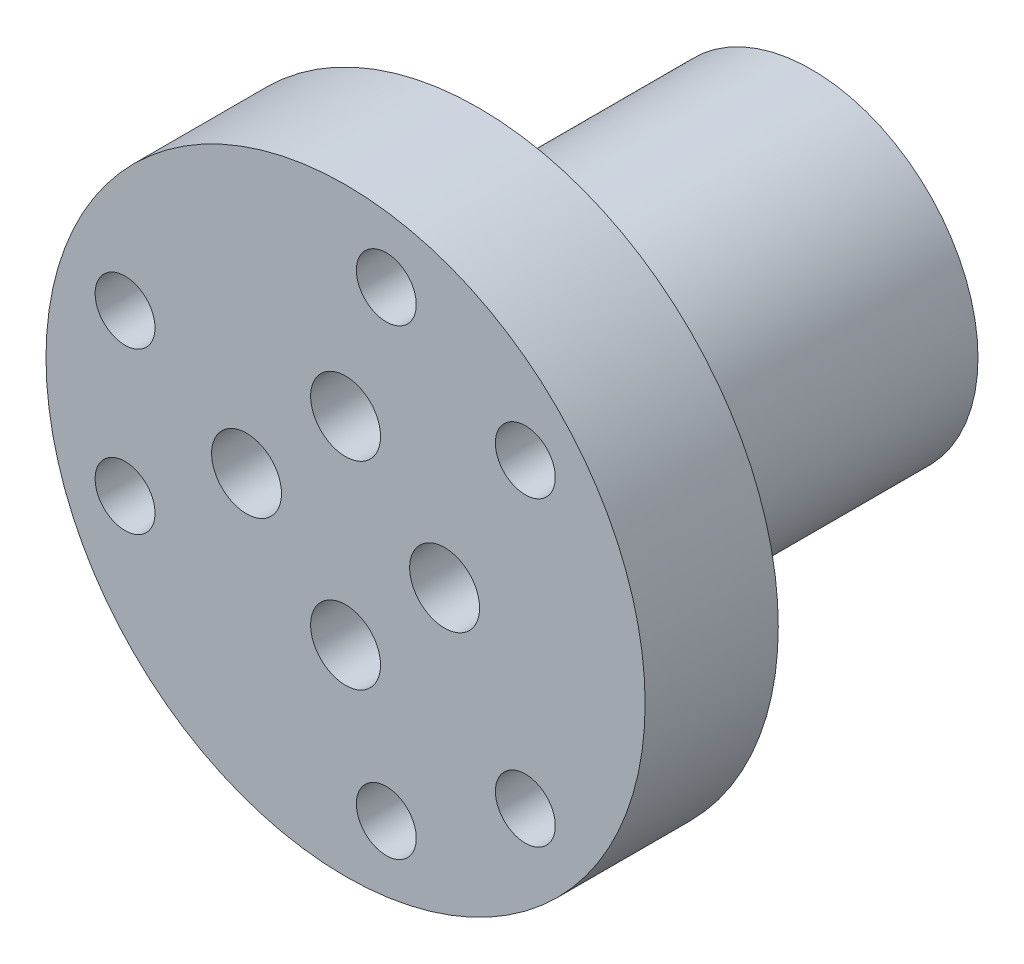
ISO-10303-21;
HEADER;
FILE_DESCRIPTION(('STEP AP214'),'2;1');
FILE_NAME('part.step','',(''),(''),'','','');
FILE_SCHEMA(('AUTOMOTIVE_DESIGN { 1 0 10303 214 1 1 1 1 }'));
ENDSEC;
DATA;
#1=APPLICATION_CONTEXT('core data for automotive mechanical design processes');
#2=APPLICATION_PROTOCOL_DEFINITION('international standard','automotive_design',2000,#1);
#3=PRODUCT_CONTEXT('',#1,'mechanical');
#4=PRODUCT('Part','Part','',(#3));
#5=PRODUCT_RELATED_PRODUCT_CATEGORY('part','',(#4));
#6=PRODUCT_DEFINITION_FORMATION('','',#4);
#7=PRODUCT_DEFINITION_CONTEXT('part definition',#1,'design');
#8=PRODUCT_DEFINITION('design','',#6,#7);
#9=PRODUCT_DEFINITION_SHAPE('','',#8);
#10=(LENGTH_UNIT() NAMED_UNIT(*) SI_UNIT(.MILLI.,.METRE.));
#11=(NAMED_UNIT(*) PLANE_ANGLE_UNIT() SI_UNIT($,.RADIAN.));
#12=(NAMED_UNIT(*) SI_UNIT($,.STERADIAN.) SOLID_ANGLE_UNIT());
#13=UNCERTAINTY_MEASURE_WITH_UNIT(LENGTH_MEASURE(1.E-05),#10,'distance_accuracy_value','');
#14=(GEOMETRIC_REPRESENTATION_CONTEXT(3) GLOBAL_UNCERTAINTY_ASSIGNED_CONTEXT((#13)) GLOBAL_UNIT_ASSIGNED_CONTEXT((#10,
#11,#12)) REPRESENTATION_CONTEXT('',''));
#15=CARTESIAN_POINT('',(0.,0.,0.));
#16=DIRECTION('',(0.,0.,1.));
#17=DIRECTION('',(1.,0.,0.));
#18=AXIS2_PLACEMENT_3D('',#15,#16,#17);
#19=CARTESIAN_POINT('',(0.,0.,0.));
#20=DIRECTION('',(0.,0.,1.));
#21=DIRECTION('',(1.,0.,0.));
#22=AXIS2_PLACEMENT_3D('',#19,#20,#21);
#23=PLANE('',#22);
#24=CARTESIAN_POINT('',(0.,0.,0.));
#25=DIRECTION('',(0.,0.,1.));
#26=DIRECTION('',(1.,0.,0.));
#27=AXIS2_PLACEMENT_3D('',#24,#25,#26);
#28=CIRCLE('',#27,18.);
#29=CARTESIAN_POINT('',(18.,0.,0.));
#30=VERTEX_POINT('',#29);
#31=EDGE_CURVE('E44',#30,#30,#28,.T.);
#32=ORIENTED_EDGE('',*,*,#31,.F.);
#33=EDGE_LOOP('',(#32));
#34=FACE_BOUND('',#33,.T.);
#35=CARTESIAN_POINT('',(10.8012266479773,9.06330529658191,0.));
#36=DIRECTION('',(0.,0.,-1.));
#37=DIRECTION('',(-1.,0.,0.));
#38=AXIS2_PLACEMENT_3D('',#35,#36,#37);
#39=CIRCLE('',#38,3.15);
#40=CARTESIAN_POINT('',(7.65122664797731,9.06330529658191,0.));
#41=VERTEX_POINT('',#40);
#42=EDGE_CURVE('E68',#41,#41,#39,.T.);
#43=ORIENTED_EDGE('',*,*,#42,.F.);
#44=EDGE_LOOP('',(#43));
#45=FACE_BOUND('',#44,.T.);
#46=CARTESIAN_POINT('',(10.8012266479789,-9.06330529657909,0.));
#47=DIRECTION('',(0.,0.,-1.));
#48=DIRECTION('',(-1.,0.,0.));
#49=AXIS2_PLACEMENT_3D('',#46,#47,#48);
#50=CIRCLE('',#49,3.15);
#51=CARTESIAN_POINT('',(7.65122664797894,-9.06330529657909,0.));
#52=VERTEX_POINT('',#51);
#53=EDGE_CURVE('E77',#52,#52,#50,.T.);
#54=ORIENTED_EDGE('',*,*,#53,.F.);
#55=EDGE_LOOP('',(#54));
#56=FACE_BOUND('',#55,.T.);
#57=CARTESIAN_POINT('',(2.44843930510505,-13.885789317471,0.));
#58=DIRECTION('',(0.,0.,-1.));
#59=DIRECTION('',(-1.,0.,0.));
#60=AXIS2_PLACEMENT_3D('',#57,#58,#59);
#61=CIRCLE('',#60,3.15);
#62=CARTESIAN_POINT('',(-0.701560694894948,-13.885789317471,0.));
#63=VERTEX_POINT('',#62);
#64=EDGE_CURVE('E86',#63,#63,#61,.T.);
#65=ORIENTED_EDGE('',*,*,#64,.F.);
#66=EDGE_LOOP('',(#65));
#67=FACE_BOUND('',#66,.T.);
#68=CARTESIAN_POINT('',(-13.2496659530813,-4.82248402089194,0.));
#69=DIRECTION('',(0.,0.,-1.));
#70=DIRECTION('',(-1.,0.,0.));
#71=AXIS2_PLACEMENT_3D('',#68,#69,#70);
#72=CIRCLE('',#71,3.15);
#73=CARTESIAN_POINT('',(-16.3996659530813,-4.82248402089194,0.));
#74=VERTEX_POINT('',#73);
#75=EDGE_CURVE('E95',#74,#74,#72,.T.);
#76=ORIENTED_EDGE('',*,*,#75,.F.);
#77=EDGE_LOOP('',(#76));
#78=FACE_BOUND('',#77,.T.);
#79=CARTESIAN_POINT('',(-13.2496659530813,4.82248402089194,0.));
#80=DIRECTION('',(0.,0.,-1.));
#81=DIRECTION('',(-1.,0.,0.));
#82=AXIS2_PLACEMENT_3D('',#79,#80,#81);
#83=CIRCLE('',#82,3.15);
#84=CARTESIAN_POINT('',(-16.3996659530813,4.82248402089194,0.));
#85=VERTEX_POINT('',#84);
#86=EDGE_CURVE('E104',#85,#85,#83,.T.);
#87=ORIENTED_EDGE('',*,*,#86,.F.);
#88=EDGE_LOOP('',(#87));
#89=FACE_BOUND('',#88,.T.);
#90=CARTESIAN_POINT('',(2.44843930510341,13.8857893174738,0.));
#91=DIRECTION('',(0.,0.,-1.));
#92=DIRECTION('',(-1.,0.,0.));
#93=AXIS2_PLACEMENT_3D('',#90,#91,#92);
#94=CIRCLE('',#93,3.15);
#95=CARTESIAN_POINT('',(-0.701560694896587,13.8857893174738,0.));
#96=VERTEX_POINT('',#95);
#97=EDGE_CURVE('E113',#96,#96,#94,.T.);
#98=ORIENTED_EDGE('',*,*,#97,.F.);
#99=EDGE_LOOP('',(#98));
#100=FACE_BOUND('',#99,.T.);
#101=CARTESIAN_POINT('',(0.,0.,0.));
#102=DIRECTION('',(0.,0.,1.));
#103=DIRECTION('',(1.,0.,0.));
#104=AXIS2_PLACEMENT_3D('',#101,#102,#103);
#105=CIRCLE('',#104,10.);
#106=CARTESIAN_POINT('',(10.,0.,0.));
#107=VERTEX_POINT('',#106);
#108=EDGE_CURVE('E10',#107,#107,#105,.F.);
#109=ORIENTED_EDGE('',*,*,#108,.F.);
#110=EDGE_LOOP('',(#109));
#111=FACE_BOUND('',#110,.T.);
#112=ADVANCED_FACE('F33',(#34,#45,#56,#67,#78,#89,#100,#111),#23,.F.);
#113=CARTESIAN_POINT('',(0.,0.,8.));
#114=DIRECTION('',(0.,0.,1.));
#115=DIRECTION('',(1.,0.,0.));
#116=AXIS2_PLACEMENT_3D('',#113,#114,#115);
#117=PLANE('',#116);
#118=CARTESIAN_POINT('',(2.44843930510341,13.8857893174738,8.));
#119=DIRECTION('',(0.,0.,-1.));
#120=DIRECTION('',(-1.,0.,0.));
#121=AXIS2_PLACEMENT_3D('',#118,#119,#120);
#122=CIRCLE('',#121,1.8);
#123=CARTESIAN_POINT('',(0.648439305103415,13.8857893174738,8.));
#124=VERTEX_POINT('',#123);
#125=EDGE_CURVE('E107',#124,#124,#122,.T.);
#126=ORIENTED_EDGE('',*,*,#125,.T.);
#127=EDGE_LOOP('',(#126));
#128=FACE_BOUND('',#127,.T.);
#129=CARTESIAN_POINT('',(-13.2496659530813,4.82248402089194,8.));
#130=DIRECTION('',(0.,0.,-1.));
#131=DIRECTION('',(-1.,0.,0.));
#132=AXIS2_PLACEMENT_3D('',#129,#130,#131);
#133=CIRCLE('',#132,1.8);
#134=CARTESIAN_POINT('',(-15.0496659530813,4.82248402089194,8.));
#135=VERTEX_POINT('',#134);
#136=EDGE_CURVE('E98',#135,#135,#133,.T.);
#137=ORIENTED_EDGE('',*,*,#136,.T.);
#138=EDGE_LOOP('',(#137));
#139=FACE_BOUND('',#138,.T.);
#140=CARTESIAN_POINT('',(-13.2496659530813,-4.82248402089194,8.));
#141=DIRECTION('',(0.,0.,-1.));
#142=DIRECTION('',(-1.,0.,0.));
#143=AXIS2_PLACEMENT_3D('',#140,#141,#142);
#144=CIRCLE('',#143,1.8);
#145=CARTESIAN_POINT('',(-15.0496659530813,-4.82248402089194,8.));
#146=VERTEX_POINT('',#145);
#147=EDGE_CURVE('E89',#146,#146,#144,.T.);
#148=ORIENTED_EDGE('',*,*,#147,.T.);
#149=EDGE_LOOP('',(#148));
#150=FACE_BOUND('',#149,.T.);
#151=CARTESIAN_POINT('',(2.44843930510505,-13.885789317471,8.));
#152=DIRECTION('',(0.,0.,-1.));
#153=DIRECTION('',(-1.,0.,0.));
#154=AXIS2_PLACEMENT_3D('',#151,#152,#153);
#155=CIRCLE('',#154,1.8);
#156=CARTESIAN_POINT('',(0.648439305105053,-13.885789317471,8.));
#157=VERTEX_POINT('',#156);
#158=EDGE_CURVE('E80',#157,#157,#155,.T.);
#159=ORIENTED_EDGE('',*,*,#158,.T.);
#160=EDGE_LOOP('',(#159));
#161=FACE_BOUND('',#160,.T.);
#162=CARTESIAN_POINT('',(10.8012266479789,-9.06330529657909,8.));
#163=DIRECTION('',(0.,0.,-1.));
#164=DIRECTION('',(-1.,0.,0.));
#165=AXIS2_PLACEMENT_3D('',#162,#163,#164);
#166=CIRCLE('',#165,1.8);
#167=CARTESIAN_POINT('',(9.00122664797894,-9.06330529657909,8.));
#168=VERTEX_POINT('',#167);
#169=EDGE_CURVE('E71',#168,#168,#166,.T.);
#170=ORIENTED_EDGE('',*,*,#169,.T.);
#171=EDGE_LOOP('',(#170));
#172=FACE_BOUND('',#171,.T.);
#173=CARTESIAN_POINT('',(10.8012266479773,9.06330529658191,8.));
#174=DIRECTION('',(0.,0.,-1.));
#175=DIRECTION('',(-1.,0.,0.));
#176=AXIS2_PLACEMENT_3D('',#173,#174,#175);
#177=CIRCLE('',#176,1.8);
#178=CARTESIAN_POINT('',(9.00122664797731,9.06330529658191,8.));
#179=VERTEX_POINT('',#178);
#180=EDGE_CURVE('E58',#179,#179,#177,.T.);
#181=ORIENTED_EDGE('',*,*,#180,.T.);
#182=EDGE_LOOP('',(#181));
#183=FACE_BOUND('',#182,.T.);
#184=CARTESIAN_POINT('',(0.,-5.95,8.));
#185=DIRECTION('',(0.,0.,1.));
#186=DIRECTION('',(1.,0.,0.));
#187=AXIS2_PLACEMENT_3D('',#184,#185,#186);
#188=CIRCLE('',#187,2.1);
#189=CARTESIAN_POINT('',(2.1,-5.95,8.));
#190=VERTEX_POINT('',#189);
#191=EDGE_CURVE('E53',#190,#190,#188,.T.);
#192=ORIENTED_EDGE('',*,*,#191,.F.);
#193=EDGE_LOOP('',(#192));
#194=FACE_BOUND('',#193,.T.);
#195=CARTESIAN_POINT('',(5.95,0.,8.));
#196=DIRECTION('',(0.,0.,1.));
#197=DIRECTION('',(1.,0.,0.));
#198=AXIS2_PLACEMENT_3D('',#195,#196,#197);
#199=CIRCLE('',#198,2.1);
#200=CARTESIAN_POINT('',(8.05,0.,8.));
#201=VERTEX_POINT('',#200);
#202=EDGE_CURVE('E57',#201,#201,#199,.T.);
#203=ORIENTED_EDGE('',*,*,#202,.F.);
#204=EDGE_LOOP('',(#203));
#205=FACE_BOUND('',#204,.T.);
#206=CARTESIAN_POINT('',(-5.95,0.,8.));
#207=DIRECTION('',(0.,0.,1.));
#208=DIRECTION('',(1.,0.,0.));
#209=AXIS2_PLACEMENT_3D('',#206,#207,#208);
#210=CIRCLE('',#209,2.1);
#211=CARTESIAN_POINT('',(-3.85,0.,8.));
#212=VERTEX_POINT('',#211);
#213=EDGE_CURVE('E54',#212,#212,#210,.T.);
#214=ORIENTED_EDGE('',*,*,#213,.F.);
#215=EDGE_LOOP('',(#214));
#216=FACE_BOUND('',#215,.T.);
#217=CARTESIAN_POINT('',(0.,5.95,8.));
#218=DIRECTION('',(0.,0.,1.));
#219=DIRECTION('',(1.,0.,0.));
#220=AXIS2_PLACEMENT_3D('',#217,#218,#219);
#221=CIRCLE('',#220,2.1);
#222=CARTESIAN_POINT('',(2.1,5.95,8.));
#223=VERTEX_POINT('',#222);
#224=EDGE_CURVE('E49',#223,#223,#221,.T.);
#225=ORIENTED_EDGE('',*,*,#224,.F.);
#226=EDGE_LOOP('',(#225));
#227=FACE_BOUND('',#226,.T.);
#228=CARTESIAN_POINT('',(0.,0.,8.));
#229=DIRECTION('',(0.,0.,1.));
#230=DIRECTION('',(1.,0.,0.));
#231=AXIS2_PLACEMENT_3D('',#228,#229,#230);
#232=CIRCLE('',#231,18.);
#233=CARTESIAN_POINT('',(18.,0.,8.));
#234=VERTEX_POINT('',#233);
#235=EDGE_CURVE('E40',#234,#234,#232,.T.);
#236=ORIENTED_EDGE('',*,*,#235,.T.);
#237=EDGE_LOOP('',(#236));
#238=FACE_BOUND('',#237,.T.);
#239=ADVANCED_FACE('F182',(#128,#139,#150,#161,#172,#183,#194,#205,#216,#227,#238),#117,.T.);
#240=CARTESIAN_POINT('',(0.,0.,8.));
#241=DIRECTION('',(0.,0.,-1.));
#242=DIRECTION('',(-1.,0.,0.));
#243=AXIS2_PLACEMENT_3D('',#240,#241,#242);
#244=CYLINDRICAL_SURFACE('',#243,18.);
#245=ORIENTED_EDGE('',*,*,#235,.F.);
#246=EDGE_LOOP('',(#245));
#247=FACE_BOUND('',#246,.T.);
#248=ORIENTED_EDGE('',*,*,#31,.T.);
#249=EDGE_LOOP('',(#248));
#250=FACE_BOUND('',#249,.T.);
#251=ADVANCED_FACE('F35',(#247,#250),#244,.T.);
#252=CARTESIAN_POINT('',(0.,5.95,1.4));
#253=DIRECTION('',(0.,0.,1.));
#254=DIRECTION('',(1.,0.,0.));
#255=AXIS2_PLACEMENT_3D('',#252,#253,#254);
#256=CYLINDRICAL_SURFACE('',#255,2.1);
#257=ORIENTED_EDGE('',*,*,#224,.T.);
#258=EDGE_LOOP('',(#257));
#259=FACE_BOUND('',#258,.T.);
#260=CARTESIAN_POINT('',(0.,5.95,-16.6));
#261=DIRECTION('',(0.,0.,-1.));
#262=DIRECTION('',(-1.,0.,0.));
#263=AXIS2_PLACEMENT_3D('',#260,#261,#262);
#264=CIRCLE('',#263,2.1);
#265=CARTESIAN_POINT('',(-2.1,5.95,-16.6));
#266=VERTEX_POINT('',#265);
#267=EDGE_CURVE('E144',#266,#266,#264,.T.);
#268=ORIENTED_EDGE('',*,*,#267,.T.);
#269=EDGE_LOOP('',(#268));
#270=FACE_BOUND('',#269,.T.);
#271=ADVANCED_FACE('F192',(#259,#270),#256,.F.);
#272=CARTESIAN_POINT('',(-5.95,0.,1.4));
#273=DIRECTION('',(0.,0.,1.));
#274=DIRECTION('',(1.,0.,0.));
#275=AXIS2_PLACEMENT_3D('',#272,#273,#274);
#276=CYLINDRICAL_SURFACE('',#275,2.1);
#277=ORIENTED_EDGE('',*,*,#213,.T.);
#278=EDGE_LOOP('',(#277));
#279=FACE_BOUND('',#278,.T.);
#280=CARTESIAN_POINT('',(-5.95,0.,-16.6));
#281=DIRECTION('',(0.,0.,-1.));
#282=DIRECTION('',(-1.,0.,0.));
#283=AXIS2_PLACEMENT_3D('',#280,#281,#282);
#284=CIRCLE('',#283,2.1);
#285=CARTESIAN_POINT('',(-8.05,0.,-16.6));
#286=VERTEX_POINT('',#285);
#287=EDGE_CURVE('E126',#286,#286,#284,.T.);
#288=ORIENTED_EDGE('',*,*,#287,.T.);
#289=EDGE_LOOP('',(#288));
#290=FACE_BOUND('',#289,.T.);
#291=ADVANCED_FACE('F195',(#279,#290),#276,.F.);
#292=CARTESIAN_POINT('',(0.,-5.95,1.4));
#293=DIRECTION('',(0.,0.,1.));
#294=DIRECTION('',(1.,0.,0.));
#295=AXIS2_PLACEMENT_3D('',#292,#293,#294);
#296=CYLINDRICAL_SURFACE('',#295,2.1);
#297=ORIENTED_EDGE('',*,*,#191,.T.);
#298=EDGE_LOOP('',(#297));
#299=FACE_BOUND('',#298,.T.);
#300=CARTESIAN_POINT('',(0.,-5.95,-16.6));
#301=DIRECTION('',(0.,0.,-1.));
#302=DIRECTION('',(-1.,0.,0.));
#303=AXIS2_PLACEMENT_3D('',#300,#301,#302);
#304=CIRCLE('',#303,2.1);
#305=CARTESIAN_POINT('',(-2.1,-5.95,-16.6));
#306=VERTEX_POINT('',#305);
#307=EDGE_CURVE('E119',#306,#306,#304,.T.);
#308=ORIENTED_EDGE('',*,*,#307,.T.);
#309=EDGE_LOOP('',(#308));
#310=FACE_BOUND('',#309,.T.);
#311=ADVANCED_FACE('F199',(#299,#310),#296,.F.);
#312=CARTESIAN_POINT('',(5.95,0.,1.4));
#313=DIRECTION('',(0.,0.,1.));
#314=DIRECTION('',(1.,0.,0.));
#315=AXIS2_PLACEMENT_3D('',#312,#313,#314);
#316=CYLINDRICAL_SURFACE('',#315,2.1);
#317=ORIENTED_EDGE('',*,*,#202,.T.);
#318=EDGE_LOOP('',(#317));
#319=FACE_BOUND('',#318,.T.);
#320=CARTESIAN_POINT('',(5.95,0.,-16.6));
#321=DIRECTION('',(0.,0.,-1.));
#322=DIRECTION('',(-1.,0.,0.));
#323=AXIS2_PLACEMENT_3D('',#320,#321,#322);
#324=CIRCLE('',#323,2.1);
#325=CARTESIAN_POINT('',(3.85,0.,-16.6));
#326=VERTEX_POINT('',#325);
#327=EDGE_CURVE('E135',#326,#326,#324,.T.);
#328=ORIENTED_EDGE('',*,*,#327,.T.);
#329=EDGE_LOOP('',(#328));
#330=FACE_BOUND('',#329,.T.);
#331=ADVANCED_FACE('F201',(#319,#330),#316,.F.);
#332=CARTESIAN_POINT('',(10.8012266479773,9.06330529658191,0.));
#333=DIRECTION('',(0.,0.,-1.));
#334=DIRECTION('',(-1.,0.,0.));
#335=AXIS2_PLACEMENT_3D('',#332,#333,#334);
#336=CYLINDRICAL_SURFACE('',#335,1.79999999999999);
#337=ORIENTED_EDGE('',*,*,#180,.F.);
#338=EDGE_LOOP('',(#337));
#339=FACE_BOUND('',#338,.T.);
#340=CARTESIAN_POINT('',(10.8012266479773,9.06330529658191,1.35));
#341=DIRECTION('',(0.,0.,-1.));
#342=DIRECTION('',(-1.,0.,0.));
#343=AXIS2_PLACEMENT_3D('',#340,#341,#342);
#344=CIRCLE('',#343,1.79999999999999);
#345=CARTESIAN_POINT('',(9.00122664797732,9.06330529658191,1.35));
#346=VERTEX_POINT('',#345);
#347=EDGE_CURVE('E65',#346,#346,#344,.T.);
#348=ORIENTED_EDGE('',*,*,#347,.T.);
#349=EDGE_LOOP('',(#348));
#350=FACE_BOUND('',#349,.T.);
#351=ADVANCED_FACE('F204',(#339,#350),#336,.F.);
#352=CARTESIAN_POINT('',(10.8012266479773,9.06330529658191,0.));
#353=DIRECTION('',(0.,0.,-1.));
#354=DIRECTION('',(-1.,0.,0.));
#355=AXIS2_PLACEMENT_3D('',#352,#353,#354);
#356=CONICAL_SURFACE('',#355,3.15,0.785398163397451);
#357=ORIENTED_EDGE('',*,*,#347,.F.);
#358=EDGE_LOOP('',(#357));
#359=FACE_BOUND('',#358,.T.);
#360=ORIENTED_EDGE('',*,*,#42,.T.);
#361=EDGE_LOOP('',(#360));
#362=FACE_BOUND('',#361,.T.);
#363=ADVANCED_FACE('F211',(#359,#362),#356,.F.);
#364=CARTESIAN_POINT('',(10.8012266479789,-9.06330529657909,0.));
#365=DIRECTION('',(0.,0.,-1.));
#366=DIRECTION('',(-1.,0.,0.));
#367=AXIS2_PLACEMENT_3D('',#364,#365,#366);
#368=CYLINDRICAL_SURFACE('',#367,1.79999999999999);
#369=ORIENTED_EDGE('',*,*,#169,.F.);
#370=EDGE_LOOP('',(#369));
#371=FACE_BOUND('',#370,.T.);
#372=CARTESIAN_POINT('',(10.8012266479789,-9.06330529657909,1.35));
#373=DIRECTION('',(0.,0.,-1.));
#374=DIRECTION('',(-1.,0.,0.));
#375=AXIS2_PLACEMENT_3D('',#372,#373,#374);
#376=CIRCLE('',#375,1.79999999999999);
#377=CARTESIAN_POINT('',(9.00122664797895,-9.06330529657909,1.35));
#378=VERTEX_POINT('',#377);
#379=EDGE_CURVE('E74',#378,#378,#376,.T.);
#380=ORIENTED_EDGE('',*,*,#379,.T.);
#381=EDGE_LOOP('',(#380));
#382=FACE_BOUND('',#381,.T.);
#383=ADVANCED_FACE('F215',(#371,#382),#368,.F.);
#384=CARTESIAN_POINT('',(10.8012266479789,-9.06330529657909,0.));
#385=DIRECTION('',(0.,0.,-1.));
#386=DIRECTION('',(-1.,0.,0.));
#387=AXIS2_PLACEMENT_3D('',#384,#385,#386);
#388=CONICAL_SURFACE('',#387,3.15,0.785398163397451);
#389=ORIENTED_EDGE('',*,*,#379,.F.);
#390=EDGE_LOOP('',(#389));
#391=FACE_BOUND('',#390,.T.);
#392=ORIENTED_EDGE('',*,*,#53,.T.);
#393=EDGE_LOOP('',(#392));
#394=FACE_BOUND('',#393,.T.);
#395=ADVANCED_FACE('F219',(#391,#394),#388,.F.);
#396=CARTESIAN_POINT('',(2.44843930510505,-13.885789317471,0.));
#397=DIRECTION('',(0.,0.,-1.));
#398=DIRECTION('',(-1.,0.,0.));
#399=AXIS2_PLACEMENT_3D('',#396,#397,#398);
#400=CYLINDRICAL_SURFACE('',#399,1.79999999999999);
#401=ORIENTED_EDGE('',*,*,#158,.F.);
#402=EDGE_LOOP('',(#401));
#403=FACE_BOUND('',#402,.T.);
#404=CARTESIAN_POINT('',(2.44843930510505,-13.885789317471,1.35));
#405=DIRECTION('',(0.,0.,-1.));
#406=DIRECTION('',(-1.,0.,0.));
#407=AXIS2_PLACEMENT_3D('',#404,#405,#406);
#408=CIRCLE('',#407,1.79999999999999);
#409=CARTESIAN_POINT('',(0.648439305105064,-13.885789317471,1.35));
#410=VERTEX_POINT('',#409);
#411=EDGE_CURVE('E83',#410,#410,#408,.T.);
#412=ORIENTED_EDGE('',*,*,#411,.T.);
#413=EDGE_LOOP('',(#412));
#414=FACE_BOUND('',#413,.T.);
#415=ADVANCED_FACE('F223',(#403,#414),#400,.F.);
#416=CARTESIAN_POINT('',(2.44843930510505,-13.885789317471,0.));
#417=DIRECTION('',(0.,0.,-1.));
#418=DIRECTION('',(-1.,0.,0.));
#419=AXIS2_PLACEMENT_3D('',#416,#417,#418);
#420=CONICAL_SURFACE('',#419,3.15,0.785398163397451);
#421=ORIENTED_EDGE('',*,*,#411,.F.);
#422=EDGE_LOOP('',(#421));
#423=FACE_BOUND('',#422,.T.);
#424=ORIENTED_EDGE('',*,*,#64,.T.);
#425=EDGE_LOOP('',(#424));
#426=FACE_BOUND('',#425,.T.);
#427=ADVANCED_FACE('F227',(#423,#426),#420,.F.);
#428=CARTESIAN_POINT('',(-13.2496659530813,-4.82248402089194,0.));
#429=DIRECTION('',(0.,0.,-1.));
#430=DIRECTION('',(-1.,0.,0.));
#431=AXIS2_PLACEMENT_3D('',#428,#429,#430);
#432=CYLINDRICAL_SURFACE('',#431,1.79999999999999);
#433=ORIENTED_EDGE('',*,*,#147,.F.);
#434=EDGE_LOOP('',(#433));
#435=FACE_BOUND('',#434,.T.);
#436=CARTESIAN_POINT('',(-13.2496659530813,-4.82248402089194,1.35));
#437=DIRECTION('',(0.,0.,-1.));
#438=DIRECTION('',(-1.,0.,0.));
#439=AXIS2_PLACEMENT_3D('',#436,#437,#438);
#440=CIRCLE('',#439,1.79999999999999);
#441=CARTESIAN_POINT('',(-15.0496659530813,-4.82248402089194,1.35));
#442=VERTEX_POINT('',#441);
#443=EDGE_CURVE('E92',#442,#442,#440,.T.);
#444=ORIENTED_EDGE('',*,*,#443,.T.);
#445=EDGE_LOOP('',(#444));
#446=FACE_BOUND('',#445,.T.);
#447=ADVANCED_FACE('F231',(#435,#446),#432,.F.);
#448=CARTESIAN_POINT('',(-13.2496659530813,-4.82248402089194,0.));
#449=DIRECTION('',(0.,0.,-1.));
#450=DIRECTION('',(-1.,0.,0.));
#451=AXIS2_PLACEMENT_3D('',#448,#449,#450);
#452=CONICAL_SURFACE('',#451,3.15,0.785398163397451);
#453=ORIENTED_EDGE('',*,*,#443,.F.);
#454=EDGE_LOOP('',(#453));
#455=FACE_BOUND('',#454,.T.);
#456=ORIENTED_EDGE('',*,*,#75,.T.);
#457=EDGE_LOOP('',(#456));
#458=FACE_BOUND('',#457,.T.);
#459=ADVANCED_FACE('F235',(#455,#458),#452,.F.);
#460=CARTESIAN_POINT('',(-13.2496659530813,4.82248402089194,0.));
#461=DIRECTION('',(0.,0.,-1.));
#462=DIRECTION('',(-1.,0.,0.));
#463=AXIS2_PLACEMENT_3D('',#460,#461,#462);
#464=CYLINDRICAL_SURFACE('',#463,1.79999999999999);
#465=ORIENTED_EDGE('',*,*,#136,.F.);
#466=EDGE_LOOP('',(#465));
#467=FACE_BOUND('',#466,.T.);
#468=CARTESIAN_POINT('',(-13.2496659530813,4.82248402089194,1.35));
#469=DIRECTION('',(0.,0.,-1.));
#470=DIRECTION('',(-1.,0.,0.));
#471=AXIS2_PLACEMENT_3D('',#468,#469,#470);
#472=CIRCLE('',#471,1.79999999999999);
#473=CARTESIAN_POINT('',(-15.0496659530813,4.82248402089194,1.35));
#474=VERTEX_POINT('',#473);
#475=EDGE_CURVE('E101',#474,#474,#472,.T.);
#476=ORIENTED_EDGE('',*,*,#475,.T.);
#477=EDGE_LOOP('',(#476));
#478=FACE_BOUND('',#477,.T.);
#479=ADVANCED_FACE('F239',(#467,#478),#464,.F.);
#480=CARTESIAN_POINT('',(-13.2496659530813,4.82248402089194,0.));
#481=DIRECTION('',(0.,0.,-1.));
#482=DIRECTION('',(-1.,0.,0.));
#483=AXIS2_PLACEMENT_3D('',#480,#481,#482);
#484=CONICAL_SURFACE('',#483,3.15,0.785398163397451);
#485=ORIENTED_EDGE('',*,*,#475,.F.);
#486=EDGE_LOOP('',(#485));
#487=FACE_BOUND('',#486,.T.);
#488=ORIENTED_EDGE('',*,*,#86,.T.);
#489=EDGE_LOOP('',(#488));
#490=FACE_BOUND('',#489,.T.);
#491=ADVANCED_FACE('F243',(#487,#490),#484,.F.);
#492=CARTESIAN_POINT('',(2.44843930510341,13.8857893174738,0.));
#493=DIRECTION('',(0.,0.,-1.));
#494=DIRECTION('',(-1.,0.,0.));
#495=AXIS2_PLACEMENT_3D('',#492,#493,#494);
#496=CYLINDRICAL_SURFACE('',#495,1.79999999999999);
#497=ORIENTED_EDGE('',*,*,#125,.F.);
#498=EDGE_LOOP('',(#497));
#499=FACE_BOUND('',#498,.T.);
#500=CARTESIAN_POINT('',(2.44843930510341,13.8857893174738,1.35));
#501=DIRECTION('',(0.,0.,-1.));
#502=DIRECTION('',(-1.,0.,0.));
#503=AXIS2_PLACEMENT_3D('',#500,#501,#502);
#504=CIRCLE('',#503,1.79999999999999);
#505=CARTESIAN_POINT('',(0.648439305103426,13.8857893174738,1.35));
#506=VERTEX_POINT('',#505);
#507=EDGE_CURVE('E110',#506,#506,#504,.T.);
#508=ORIENTED_EDGE('',*,*,#507,.T.);
#509=EDGE_LOOP('',(#508));
#510=FACE_BOUND('',#509,.T.);
#511=ADVANCED_FACE('F247',(#499,#510),#496,.F.);
#512=CARTESIAN_POINT('',(2.44843930510341,13.8857893174738,0.));
#513=DIRECTION('',(0.,0.,-1.));
#514=DIRECTION('',(-1.,0.,0.));
#515=AXIS2_PLACEMENT_3D('',#512,#513,#514);
#516=CONICAL_SURFACE('',#515,3.15,0.785398163397451);
#517=ORIENTED_EDGE('',*,*,#507,.F.);
#518=EDGE_LOOP('',(#517));
#519=FACE_BOUND('',#518,.T.);
#520=ORIENTED_EDGE('',*,*,#97,.T.);
#521=EDGE_LOOP('',(#520));
#522=FACE_BOUND('',#521,.T.);
#523=ADVANCED_FACE('F178',(#519,#522),#516,.F.);
#524=CARTESIAN_POINT('',(0.,0.,-2.));
#525=DIRECTION('',(0.,0.,1.));
#526=DIRECTION('',(1.,0.,0.));
#527=AXIS2_PLACEMENT_3D('',#524,#525,#526);
#528=CYLINDRICAL_SURFACE('',#527,10.);
#529=ORIENTED_EDGE('',*,*,#108,.T.);
#530=EDGE_LOOP('',(#529));
#531=FACE_BOUND('',#530,.T.);
#532=CARTESIAN_POINT('',(0.,0.,-20.));
#533=DIRECTION('',(0.,0.,-1.));
#534=DIRECTION('',(-1.,0.,0.));
#535=AXIS2_PLACEMENT_3D('',#532,#533,#534);
#536=CIRCLE('',#535,10.);
#537=CARTESIAN_POINT('',(-10.,0.,-20.));
#538=VERTEX_POINT('',#537);
#539=EDGE_CURVE('E116',#538,#538,#536,.T.);
#540=ORIENTED_EDGE('',*,*,#539,.F.);
#541=EDGE_LOOP('',(#540));
#542=FACE_BOUND('',#541,.T.);
#543=ADVANCED_FACE('F168',(#531,#542),#528,.T.);
#544=CARTESIAN_POINT('',(0.,0.,-20.));
#545=DIRECTION('',(0.,0.,-1.));
#546=DIRECTION('',(-1.,0.,0.));
#547=AXIS2_PLACEMENT_3D('',#544,#545,#546);
#548=PLANE('',#547);
#549=ORIENTED_EDGE('',*,*,#539,.T.);
#550=EDGE_LOOP('',(#549));
#551=FACE_BOUND('',#550,.T.);
#552=CARTESIAN_POINT('',(0.,-5.95,-20.));
#553=DIRECTION('',(0.,0.,-1.));
#554=DIRECTION('',(-1.,0.,0.));
#555=AXIS2_PLACEMENT_3D('',#552,#553,#554);
#556=CIRCLE('',#555,1.25);
#557=CARTESIAN_POINT('',(-1.25,-5.95,-20.));
#558=VERTEX_POINT('',#557);
#559=EDGE_CURVE('E123',#558,#558,#556,.T.);
#560=ORIENTED_EDGE('',*,*,#559,.F.);
#561=EDGE_LOOP('',(#560));
#562=FACE_BOUND('',#561,.T.);
#563=CARTESIAN_POINT('',(-5.95,0.,-20.));
#564=DIRECTION('',(0.,0.,-1.));
#565=DIRECTION('',(-1.,0.,0.));
#566=AXIS2_PLACEMENT_3D('',#563,#564,#565);
#567=CIRCLE('',#566,1.25);
#568=CARTESIAN_POINT('',(-7.2,0.,-20.));
#569=VERTEX_POINT('',#568);
#570=EDGE_CURVE('E132',#569,#569,#567,.T.);
#571=ORIENTED_EDGE('',*,*,#570,.F.);
#572=EDGE_LOOP('',(#571));
#573=FACE_BOUND('',#572,.T.);
#574=CARTESIAN_POINT('',(5.95,0.,-20.));
#575=DIRECTION('',(0.,0.,-1.));
#576=DIRECTION('',(-1.,0.,0.));
#577=AXIS2_PLACEMENT_3D('',#574,#575,#576);
#578=CIRCLE('',#577,1.25);
#579=CARTESIAN_POINT('',(4.7,0.,-20.));
#580=VERTEX_POINT('',#579);
#581=EDGE_CURVE('E141',#580,#580,#578,.T.);
#582=ORIENTED_EDGE('',*,*,#581,.F.);
#583=EDGE_LOOP('',(#582));
#584=FACE_BOUND('',#583,.T.);
#585=CARTESIAN_POINT('',(0.,5.95,-20.));
#586=DIRECTION('',(0.,0.,-1.));
#587=DIRECTION('',(-1.,0.,0.));
#588=AXIS2_PLACEMENT_3D('',#585,#586,#587);
#589=CIRCLE('',#588,1.25);
#590=CARTESIAN_POINT('',(-1.25,5.95,-20.));
#591=VERTEX_POINT('',#590);
#592=EDGE_CURVE('E150',#591,#591,#589,.T.);
#593=ORIENTED_EDGE('',*,*,#592,.F.);
#594=EDGE_LOOP('',(#593));
#595=FACE_BOUND('',#594,.T.);
#596=ADVANCED_FACE('F165',(#551,#562,#573,#584,#595),#548,.T.);
#597=CARTESIAN_POINT('',(0.,-5.95,-16.6));
#598=DIRECTION('',(0.,0.,-1.));
#599=DIRECTION('',(-1.,0.,0.));
#600=AXIS2_PLACEMENT_3D('',#597,#598,#599);
#601=PLANE('',#600);
#602=CARTESIAN_POINT('',(0.,-5.95,-16.6));
#603=DIRECTION('',(0.,0.,-1.));
#604=DIRECTION('',(-1.,0.,0.));
#605=AXIS2_PLACEMENT_3D('',#602,#603,#604);
#606=CIRCLE('',#605,1.25);
#607=CARTESIAN_POINT('',(-1.25,-5.95,-16.6));
#608=VERTEX_POINT('',#607);
#609=EDGE_CURVE('E122',#608,#608,#606,.T.);
#610=ORIENTED_EDGE('',*,*,#609,.T.);
#611=EDGE_LOOP('',(#610));
#612=FACE_BOUND('',#611,.T.);
#613=ORIENTED_EDGE('',*,*,#307,.F.);
#614=EDGE_LOOP('',(#613));
#615=FACE_BOUND('',#614,.T.);
#616=ADVANCED_FACE('F167',(#612,#615),#601,.F.);
#617=CARTESIAN_POINT('',(0.,-5.95,-16.6));
#618=DIRECTION('',(0.,0.,-1.));
#619=DIRECTION('',(-1.,0.,0.));
#620=AXIS2_PLACEMENT_3D('',#617,#618,#619);
#621=CYLINDRICAL_SURFACE('',#620,1.25);
#622=ORIENTED_EDGE('',*,*,#609,.F.);
#623=EDGE_LOOP('',(#622));
#624=FACE_BOUND('',#623,.T.);
#625=ORIENTED_EDGE('',*,*,#559,.T.);
#626=EDGE_LOOP('',(#625));
#627=FACE_BOUND('',#626,.T.);
#628=ADVANCED_FACE('F175',(#624,#627),#621,.F.);
#629=CARTESIAN_POINT('',(-5.95,0.,-16.6));
#630=DIRECTION('',(0.,0.,-1.));
#631=DIRECTION('',(-1.,0.,0.));
#632=AXIS2_PLACEMENT_3D('',#629,#630,#631);
#633=PLANE('',#632);
#634=CARTESIAN_POINT('',(-5.95,0.,-16.6));
#635=DIRECTION('',(0.,0.,-1.));
#636=DIRECTION('',(-1.,0.,0.));
#637=AXIS2_PLACEMENT_3D('',#634,#635,#636);
#638=CIRCLE('',#637,1.25);
#639=CARTESIAN_POINT('',(-7.2,0.,-16.6));
#640=VERTEX_POINT('',#639);
#641=EDGE_CURVE('E131',#640,#640,#638,.T.);
#642=ORIENTED_EDGE('',*,*,#641,.T.);
#643=EDGE_LOOP('',(#642));
#644=FACE_BOUND('',#643,.T.);
#645=ORIENTED_EDGE('',*,*,#287,.F.);
#646=EDGE_LOOP('',(#645));
#647=FACE_BOUND('',#646,.T.);
#648=ADVANCED_FACE('F292',(#644,#647),#633,.F.);
#649=CARTESIAN_POINT('',(-5.95,0.,-16.6));
#650=DIRECTION('',(0.,0.,-1.));
#651=DIRECTION('',(-1.,0.,0.));
#652=AXIS2_PLACEMENT_3D('',#649,#650,#651);
#653=CYLINDRICAL_SURFACE('',#652,1.25);
#654=ORIENTED_EDGE('',*,*,#641,.F.);
#655=EDGE_LOOP('',(#654));
#656=FACE_BOUND('',#655,.T.);
#657=ORIENTED_EDGE('',*,*,#570,.T.);
#658=EDGE_LOOP('',(#657));
#659=FACE_BOUND('',#658,.T.);
#660=ADVANCED_FACE('F302',(#656,#659),#653,.F.);
#661=CARTESIAN_POINT('',(5.95,0.,-16.6));
#662=DIRECTION('',(0.,0.,-1.));
#663=DIRECTION('',(-1.,0.,0.));
#664=AXIS2_PLACEMENT_3D('',#661,#662,#663);
#665=PLANE('',#664);
#666=CARTESIAN_POINT('',(5.95,0.,-16.6));
#667=DIRECTION('',(0.,0.,-1.));
#668=DIRECTION('',(-1.,0.,0.));
#669=AXIS2_PLACEMENT_3D('',#666,#667,#668);
#670=CIRCLE('',#669,1.25);
#671=CARTESIAN_POINT('',(4.7,0.,-16.6));
#672=VERTEX_POINT('',#671);
#673=EDGE_CURVE('E140',#672,#672,#670,.T.);
#674=ORIENTED_EDGE('',*,*,#673,.T.);
#675=EDGE_LOOP('',(#674));
#676=FACE_BOUND('',#675,.T.);
#677=ORIENTED_EDGE('',*,*,#327,.F.);
#678=EDGE_LOOP('',(#677));
#679=FACE_BOUND('',#678,.T.);
#680=ADVANCED_FACE('F312',(#676,#679),#665,.F.);
#681=CARTESIAN_POINT('',(5.95,0.,-16.6));
#682=DIRECTION('',(0.,0.,-1.));
#683=DIRECTION('',(-1.,0.,0.));
#684=AXIS2_PLACEMENT_3D('',#681,#682,#683);
#685=CYLINDRICAL_SURFACE('',#684,1.25);
#686=ORIENTED_EDGE('',*,*,#673,.F.);
#687=EDGE_LOOP('',(#686));
#688=FACE_BOUND('',#687,.T.);
#689=ORIENTED_EDGE('',*,*,#581,.T.);
#690=EDGE_LOOP('',(#689));
#691=FACE_BOUND('',#690,.T.);
#692=ADVANCED_FACE('F322',(#688,#691),#685,.F.);
#693=CARTESIAN_POINT('',(0.,5.95,-16.6));
#694=DIRECTION('',(0.,0.,-1.));
#695=DIRECTION('',(-1.,0.,0.));
#696=AXIS2_PLACEMENT_3D('',#693,#694,#695);
#697=PLANE('',#696);
#698=CARTESIAN_POINT('',(0.,5.95,-16.6));
#699=DIRECTION('',(0.,0.,-1.));
#700=DIRECTION('',(-1.,0.,0.));
#701=AXIS2_PLACEMENT_3D('',#698,#699,#700);
#702=CIRCLE('',#701,1.25);
#703=CARTESIAN_POINT('',(-1.25,5.95,-16.6));
#704=VERTEX_POINT('',#703);
#705=EDGE_CURVE('E149',#704,#704,#702,.T.);
#706=ORIENTED_EDGE('',*,*,#705,.T.);
#707=EDGE_LOOP('',(#706));
#708=FACE_BOUND('',#707,.T.);
#709=ORIENTED_EDGE('',*,*,#267,.F.);
#710=EDGE_LOOP('',(#709));
#711=FACE_BOUND('',#710,.T.);
#712=ADVANCED_FACE('F156',(#708,#711),#697,.F.);
#713=CARTESIAN_POINT('',(0.,5.95,-16.6));
#714=DIRECTION('',(0.,0.,-1.));
#715=DIRECTION('',(-1.,0.,0.));
#716=AXIS2_PLACEMENT_3D('',#713,#714,#715);
#717=CYLINDRICAL_SURFACE('',#716,1.25);
#718=ORIENTED_EDGE('',*,*,#705,.F.);
#719=EDGE_LOOP('',(#718));
#720=FACE_BOUND('',#719,.T.);
#721=ORIENTED_EDGE('',*,*,#592,.T.);
#722=EDGE_LOOP('',(#721));
#723=FACE_BOUND('',#722,.T.);
#724=ADVANCED_FACE('F159',(#720,#723),#717,.F.);
#725=CLOSED_SHELL('',(#112,#239,#251,#271,#291,#311,#331,#351,#363,#383,#395,#415,#427,#447,
#459,#479,#491,#511,#523,#543,#596,#616,#628,#648,#660,#680,#692,#712,#724));
#726=MANIFOLD_SOLID_BREP('B2',#725);
#727=ADVANCED_BREP_SHAPE_REPRESENTATION('',(#18,#726),#14);
#728=SHAPE_DEFINITION_REPRESENTATION(#9,#727);
ENDSEC;
END-ISO-10303-21;
